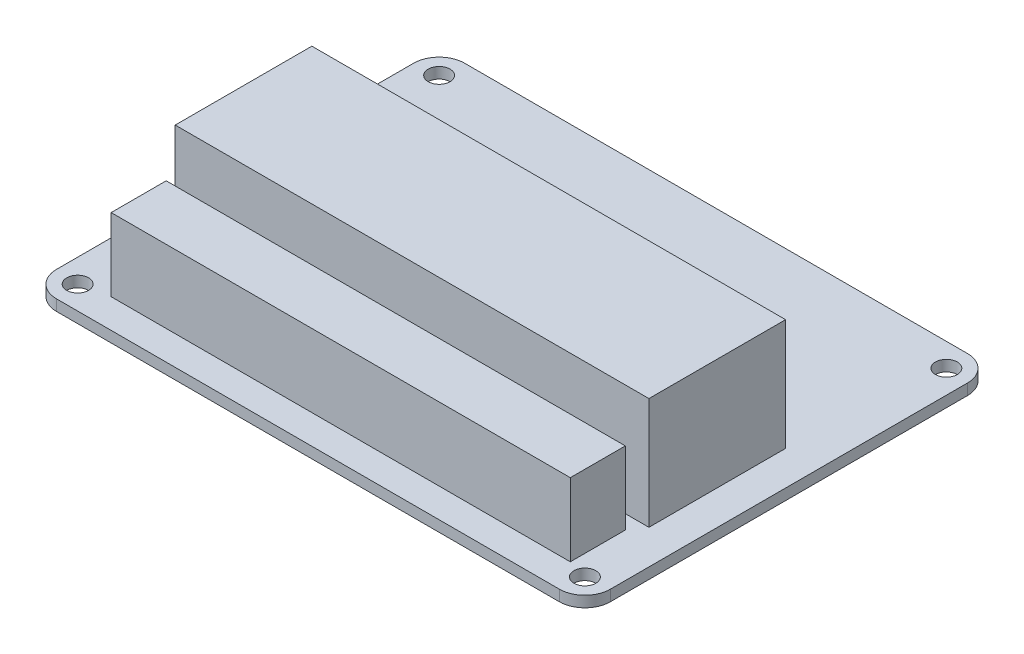
ISO-10303-21;
HEADER;
FILE_DESCRIPTION(('STEP AP214'),'2;1');
FILE_NAME('part.step','',(''),(''),'','','');
FILE_SCHEMA(('AUTOMOTIVE_DESIGN { 1 0 10303 214 1 1 1 1 }'));
ENDSEC;
DATA;
#1=APPLICATION_CONTEXT('core data for automotive mechanical design processes');
#2=APPLICATION_PROTOCOL_DEFINITION('international standard','automotive_design',2000,#1);
#3=PRODUCT_CONTEXT('',#1,'mechanical');
#4=PRODUCT('Part','Part','',(#3));
#5=PRODUCT_RELATED_PRODUCT_CATEGORY('part','',(#4));
#6=PRODUCT_DEFINITION_FORMATION('','',#4);
#7=PRODUCT_DEFINITION_CONTEXT('part definition',#1,'design');
#8=PRODUCT_DEFINITION('design','',#6,#7);
#9=PRODUCT_DEFINITION_SHAPE('','',#8);
#10=(LENGTH_UNIT() NAMED_UNIT(*) SI_UNIT(.MILLI.,.METRE.));
#11=(NAMED_UNIT(*) PLANE_ANGLE_UNIT() SI_UNIT($,.RADIAN.));
#12=(NAMED_UNIT(*) SI_UNIT($,.STERADIAN.) SOLID_ANGLE_UNIT());
#13=UNCERTAINTY_MEASURE_WITH_UNIT(LENGTH_MEASURE(1.E-05),#10,'distance_accuracy_value','');
#14=(GEOMETRIC_REPRESENTATION_CONTEXT(3) GLOBAL_UNCERTAINTY_ASSIGNED_CONTEXT((#13)) GLOBAL_UNIT_ASSIGNED_CONTEXT((#10,
#11,#12)) REPRESENTATION_CONTEXT('',''));
#15=CARTESIAN_POINT('',(0.,0.,0.));
#16=DIRECTION('',(0.,0.,1.));
#17=DIRECTION('',(1.,0.,0.));
#18=AXIS2_PLACEMENT_3D('',#15,#16,#17);
#19=CARTESIAN_POINT('',(0.,1.5,56.));
#20=DIRECTION('',(0.,0.,1.));
#21=DIRECTION('',(1.,0.,0.));
#22=AXIS2_PLACEMENT_3D('',#19,#20,#21);
#23=PLANE('',#22);
#24=DIRECTION('',(-1.,0.,0.));
#25=VECTOR('',#24,1.);
#26=CARTESIAN_POINT('',(0.,0.,56.));
#27=LINE('',#26,#25);
#28=CARTESIAN_POINT('',(72.5,0.,56.));
#29=VERTEX_POINT('',#28);
#30=CARTESIAN_POINT('',(3.5,0.,56.));
#31=VERTEX_POINT('',#30);
#32=EDGE_CURVE('E248',#29,#31,#27,.T.);
#33=ORIENTED_EDGE('',*,*,#32,.F.);
#34=DIRECTION('',(0.,-1.,0.));
#35=VECTOR('',#34,1.);
#36=CARTESIAN_POINT('',(72.5,1.5,56.));
#37=LINE('',#36,#35);
#38=CARTESIAN_POINT('',(72.5,1.5,56.));
#39=VERTEX_POINT('',#38);
#40=EDGE_CURVE('E296',#29,#39,#37,.F.);
#41=ORIENTED_EDGE('',*,*,#40,.T.);
#42=DIRECTION('',(-1.,0.,0.));
#43=VECTOR('',#42,1.);
#44=CARTESIAN_POINT('',(0.,1.5,56.));
#45=LINE('',#44,#43);
#46=CARTESIAN_POINT('',(3.5,1.5,56.));
#47=VERTEX_POINT('',#46);
#48=EDGE_CURVE('E223',#39,#47,#45,.T.);
#49=ORIENTED_EDGE('',*,*,#48,.T.);
#50=DIRECTION('',(0.,-1.,0.));
#51=VECTOR('',#50,1.);
#52=CARTESIAN_POINT('',(3.5,0.,56.));
#53=LINE('',#52,#51);
#54=EDGE_CURVE('E293',#47,#31,#53,.T.);
#55=ORIENTED_EDGE('',*,*,#54,.T.);
#56=EDGE_LOOP('',(#33,#41,#49,#55));
#57=FACE_BOUND('',#56,.T.);
#58=ADVANCED_FACE('F39',(#57),#23,.T.);
#59=CARTESIAN_POINT('',(76.,1.5,0.));
#60=DIRECTION('',(1.,0.,0.));
#61=DIRECTION('',(0.,0.,-1.));
#62=AXIS2_PLACEMENT_3D('',#59,#60,#61);
#63=PLANE('',#62);
#64=DIRECTION('',(0.,0.,1.));
#65=VECTOR('',#64,1.);
#66=CARTESIAN_POINT('',(76.,0.,0.));
#67=LINE('',#66,#65);
#68=CARTESIAN_POINT('',(76.,0.,3.49999999999999));
#69=VERTEX_POINT('',#68);
#70=CARTESIAN_POINT('',(76.,0.,52.5));
#71=VERTEX_POINT('',#70);
#72=EDGE_CURVE('E251',#69,#71,#67,.T.);
#73=ORIENTED_EDGE('',*,*,#72,.F.);
#74=DIRECTION('',(0.,-1.,0.));
#75=VECTOR('',#74,1.);
#76=CARTESIAN_POINT('',(76.,1.5,3.49999999999999));
#77=LINE('',#76,#75);
#78=CARTESIAN_POINT('',(76.,1.5,3.49999999999999));
#79=VERTEX_POINT('',#78);
#80=EDGE_CURVE('E283',#69,#79,#77,.F.);
#81=ORIENTED_EDGE('',*,*,#80,.T.);
#82=DIRECTION('',(0.,0.,1.));
#83=VECTOR('',#82,1.);
#84=CARTESIAN_POINT('',(76.,1.5,0.));
#85=LINE('',#84,#83);
#86=CARTESIAN_POINT('',(76.,1.5,52.5));
#87=VERTEX_POINT('',#86);
#88=EDGE_CURVE('E227',#79,#87,#85,.T.);
#89=ORIENTED_EDGE('',*,*,#88,.T.);
#90=DIRECTION('',(0.,-1.,0.));
#91=VECTOR('',#90,1.);
#92=CARTESIAN_POINT('',(76.,1.5,52.5));
#93=LINE('',#92,#91);
#94=EDGE_CURVE('E280',#87,#71,#93,.T.);
#95=ORIENTED_EDGE('',*,*,#94,.T.);
#96=EDGE_LOOP('',(#73,#81,#89,#95));
#97=FACE_BOUND('',#96,.T.);
#98=ADVANCED_FACE('F328',(#97),#63,.T.);
#99=CARTESIAN_POINT('',(0.,1.5,0.));
#100=DIRECTION('',(0.,0.,1.));
#101=DIRECTION('',(1.,0.,0.));
#102=AXIS2_PLACEMENT_3D('',#99,#100,#101);
#103=PLANE('',#102);
#104=DIRECTION('',(-1.,0.,0.));
#105=VECTOR('',#104,1.);
#106=CARTESIAN_POINT('',(0.,1.5,0.));
#107=LINE('',#106,#105);
#108=CARTESIAN_POINT('',(72.5,1.5,0.));
#109=VERTEX_POINT('',#108);
#110=CARTESIAN_POINT('',(3.5,1.5,0.));
#111=VERTEX_POINT('',#110);
#112=EDGE_CURVE('E230',#109,#111,#107,.T.);
#113=ORIENTED_EDGE('',*,*,#112,.F.);
#114=DIRECTION('',(0.,-1.,0.));
#115=VECTOR('',#114,1.);
#116=CARTESIAN_POINT('',(72.5,0.,0.));
#117=LINE('',#116,#115);
#118=CARTESIAN_POINT('',(72.5,0.,0.));
#119=VERTEX_POINT('',#118);
#120=EDGE_CURVE('E269',#109,#119,#117,.T.);
#121=ORIENTED_EDGE('',*,*,#120,.T.);
#122=DIRECTION('',(-1.,0.,0.));
#123=VECTOR('',#122,1.);
#124=CARTESIAN_POINT('',(0.,0.,0.));
#125=LINE('',#124,#123);
#126=CARTESIAN_POINT('',(3.5,0.,0.));
#127=VERTEX_POINT('',#126);
#128=EDGE_CURVE('E254',#119,#127,#125,.T.);
#129=ORIENTED_EDGE('',*,*,#128,.T.);
#130=DIRECTION('',(0.,-1.,0.));
#131=VECTOR('',#130,1.);
#132=CARTESIAN_POINT('',(3.5,1.5,0.));
#133=LINE('',#132,#131);
#134=EDGE_CURVE('E245',#127,#111,#133,.F.);
#135=ORIENTED_EDGE('',*,*,#134,.T.);
#136=EDGE_LOOP('',(#113,#121,#129,#135));
#137=FACE_BOUND('',#136,.T.);
#138=ADVANCED_FACE('F336',(#137),#103,.F.);
#139=CARTESIAN_POINT('',(3.20000000000001,1.5,3.19999999999999));
#140=DIRECTION('',(0.,-1.,0.));
#141=DIRECTION('',(0.,0.,-1.));
#142=AXIS2_PLACEMENT_3D('',#139,#140,#141);
#143=CYLINDRICAL_SURFACE('',#142,1.5);
#144=CARTESIAN_POINT('',(3.20000000000001,1.5,3.19999999999999));
#145=DIRECTION('',(0.,1.,0.));
#146=DIRECTION('',(0.,0.,1.));
#147=AXIS2_PLACEMENT_3D('',#144,#145,#146);
#148=CIRCLE('',#147,1.5);
#149=CARTESIAN_POINT('',(3.20000000000001,1.5,4.69999999999999));
#150=VERTEX_POINT('',#149);
#151=EDGE_CURVE('E239',#150,#150,#148,.F.);
#152=ORIENTED_EDGE('',*,*,#151,.F.);
#153=EDGE_LOOP('',(#152));
#154=FACE_BOUND('',#153,.T.);
#155=CARTESIAN_POINT('',(3.20000000000001,0.,3.19999999999999));
#156=DIRECTION('',(0.,1.,0.));
#157=DIRECTION('',(0.,0.,1.));
#158=AXIS2_PLACEMENT_3D('',#155,#156,#157);
#159=CIRCLE('',#158,1.5);
#160=CARTESIAN_POINT('',(3.20000000000001,0.,4.69999999999999));
#161=VERTEX_POINT('',#160);
#162=EDGE_CURVE('E263',#161,#161,#159,.F.);
#163=ORIENTED_EDGE('',*,*,#162,.T.);
#164=EDGE_LOOP('',(#163));
#165=FACE_BOUND('',#164,.T.);
#166=ADVANCED_FACE('F551',(#154,#165),#143,.F.);
#167=CARTESIAN_POINT('',(72.8,1.5,52.8));
#168=DIRECTION('',(0.,-1.,0.));
#169=DIRECTION('',(0.,0.,-1.));
#170=AXIS2_PLACEMENT_3D('',#167,#168,#169);
#171=CYLINDRICAL_SURFACE('',#170,1.5);
#172=CARTESIAN_POINT('',(72.8,1.5,52.8));
#173=DIRECTION('',(0.,1.,0.));
#174=DIRECTION('',(0.,0.,1.));
#175=AXIS2_PLACEMENT_3D('',#172,#173,#174);
#176=CIRCLE('',#175,1.5);
#177=CARTESIAN_POINT('',(72.8,1.5,54.3));
#178=VERTEX_POINT('',#177);
#179=EDGE_CURVE('E236',#178,#178,#176,.T.);
#180=ORIENTED_EDGE('',*,*,#179,.T.);
#181=EDGE_LOOP('',(#180));
#182=FACE_BOUND('',#181,.T.);
#183=CARTESIAN_POINT('',(72.8,0.,52.8));
#184=DIRECTION('',(0.,1.,0.));
#185=DIRECTION('',(0.,0.,1.));
#186=AXIS2_PLACEMENT_3D('',#183,#184,#185);
#187=CIRCLE('',#186,1.5);
#188=CARTESIAN_POINT('',(72.8,0.,54.3));
#189=VERTEX_POINT('',#188);
#190=EDGE_CURVE('E260',#189,#189,#187,.T.);
#191=ORIENTED_EDGE('',*,*,#190,.F.);
#192=EDGE_LOOP('',(#191));
#193=FACE_BOUND('',#192,.T.);
#194=ADVANCED_FACE('F542',(#182,#193),#171,.F.);
#195=CARTESIAN_POINT('',(0.,1.5,0.));
#196=DIRECTION('',(1.,0.,0.));
#197=DIRECTION('',(0.,0.,-1.));
#198=AXIS2_PLACEMENT_3D('',#195,#196,#197);
#199=PLANE('',#198);
#200=DIRECTION('',(0.,0.,1.));
#201=VECTOR('',#200,1.);
#202=CARTESIAN_POINT('',(0.,0.,0.));
#203=LINE('',#202,#201);
#204=CARTESIAN_POINT('',(0.,0.,3.5));
#205=VERTEX_POINT('',#204);
#206=CARTESIAN_POINT('',(0.,0.,52.5));
#207=VERTEX_POINT('',#206);
#208=EDGE_CURVE('E257',#205,#207,#203,.T.);
#209=ORIENTED_EDGE('',*,*,#208,.T.);
#210=DIRECTION('',(0.,-1.,0.));
#211=VECTOR('',#210,1.);
#212=CARTESIAN_POINT('',(0.,1.5,52.5));
#213=LINE('',#212,#211);
#214=CARTESIAN_POINT('',(0.,1.5,52.5));
#215=VERTEX_POINT('',#214);
#216=EDGE_CURVE('E11',#207,#215,#213,.F.);
#217=ORIENTED_EDGE('',*,*,#216,.T.);
#218=DIRECTION('',(0.,0.,1.));
#219=VECTOR('',#218,1.);
#220=CARTESIAN_POINT('',(0.,1.5,0.));
#221=LINE('',#220,#219);
#222=CARTESIAN_POINT('',(0.,1.5,3.5));
#223=VERTEX_POINT('',#222);
#224=EDGE_CURVE('E233',#223,#215,#221,.T.);
#225=ORIENTED_EDGE('',*,*,#224,.F.);
#226=DIRECTION('',(0.,-1.,0.));
#227=VECTOR('',#226,1.);
#228=CARTESIAN_POINT('',(0.,1.5,3.5));
#229=LINE('',#228,#227);
#230=EDGE_CURVE('E47',#223,#205,#229,.T.);
#231=ORIENTED_EDGE('',*,*,#230,.T.);
#232=EDGE_LOOP('',(#209,#217,#225,#231));
#233=FACE_BOUND('',#232,.T.);
#234=ADVANCED_FACE('F302',(#233),#199,.F.);
#235=CARTESIAN_POINT('',(72.8,1.5,3.19999999999999));
#236=DIRECTION('',(0.,-1.,0.));
#237=DIRECTION('',(0.,0.,-1.));
#238=AXIS2_PLACEMENT_3D('',#235,#236,#237);
#239=CYLINDRICAL_SURFACE('',#238,1.5);
#240=CARTESIAN_POINT('',(72.8,1.5,3.19999999999999));
#241=DIRECTION('',(0.,1.,0.));
#242=DIRECTION('',(0.,0.,1.));
#243=AXIS2_PLACEMENT_3D('',#240,#241,#242);
#244=CIRCLE('',#243,1.5);
#245=CARTESIAN_POINT('',(72.8,1.5,4.69999999999999));
#246=VERTEX_POINT('',#245);
#247=EDGE_CURVE('E220',#246,#246,#244,.T.);
#248=ORIENTED_EDGE('',*,*,#247,.T.);
#249=EDGE_LOOP('',(#248));
#250=FACE_BOUND('',#249,.T.);
#251=CARTESIAN_POINT('',(72.8,0.,3.19999999999999));
#252=DIRECTION('',(0.,1.,0.));
#253=DIRECTION('',(0.,0.,1.));
#254=AXIS2_PLACEMENT_3D('',#251,#252,#253);
#255=CIRCLE('',#254,1.5);
#256=CARTESIAN_POINT('',(72.8,0.,4.69999999999999));
#257=VERTEX_POINT('',#256);
#258=EDGE_CURVE('E219',#257,#257,#255,.T.);
#259=ORIENTED_EDGE('',*,*,#258,.F.);
#260=EDGE_LOOP('',(#259));
#261=FACE_BOUND('',#260,.T.);
#262=ADVANCED_FACE('F355',(#250,#261),#239,.F.);
#263=CARTESIAN_POINT('',(3.19999999999999,1.5,52.8));
#264=DIRECTION('',(0.,-1.,0.));
#265=DIRECTION('',(0.,0.,-1.));
#266=AXIS2_PLACEMENT_3D('',#263,#264,#265);
#267=CYLINDRICAL_SURFACE('',#266,1.5);
#268=CARTESIAN_POINT('',(3.19999999999999,1.5,52.8));
#269=DIRECTION('',(0.,1.,0.));
#270=DIRECTION('',(0.,0.,1.));
#271=AXIS2_PLACEMENT_3D('',#268,#269,#270);
#272=CIRCLE('',#271,1.5);
#273=CARTESIAN_POINT('',(3.19999999999999,1.5,54.3));
#274=VERTEX_POINT('',#273);
#275=EDGE_CURVE('E242',#274,#274,#272,.F.);
#276=ORIENTED_EDGE('',*,*,#275,.F.);
#277=EDGE_LOOP('',(#276));
#278=FACE_BOUND('',#277,.T.);
#279=CARTESIAN_POINT('',(3.19999999999999,0.,52.8));
#280=DIRECTION('',(0.,1.,0.));
#281=DIRECTION('',(0.,0.,1.));
#282=AXIS2_PLACEMENT_3D('',#279,#280,#281);
#283=CIRCLE('',#282,1.5);
#284=CARTESIAN_POINT('',(3.19999999999999,0.,54.3));
#285=VERTEX_POINT('',#284);
#286=EDGE_CURVE('E224',#285,#285,#283,.F.);
#287=ORIENTED_EDGE('',*,*,#286,.T.);
#288=EDGE_LOOP('',(#287));
#289=FACE_BOUND('',#288,.T.);
#290=ADVANCED_FACE('F358',(#278,#289),#267,.F.);
#291=CARTESIAN_POINT('',(0.,1.5,0.));
#292=DIRECTION('',(0.,1.,0.));
#293=DIRECTION('',(0.,0.,1.));
#294=AXIS2_PLACEMENT_3D('',#291,#292,#293);
#295=PLANE('',#294);
#296=DIRECTION('',(0.,0.,-1.));
#297=VECTOR('',#296,1.);
#298=CARTESIAN_POINT('',(6.29412363771111,1.5,0.));
#299=LINE('',#298,#297);
#300=CARTESIAN_POINT('',(6.29412363771111,1.5,42.5053644216807));
#301=VERTEX_POINT('',#300);
#302=CARTESIAN_POINT('',(6.29412363771111,1.5,23.7553644216807));
#303=VERTEX_POINT('',#302);
#304=EDGE_CURVE('E160',#301,#303,#299,.T.);
#305=ORIENTED_EDGE('',*,*,#304,.T.);
#306=DIRECTION('',(-1.,0.,0.));
#307=VECTOR('',#306,1.);
#308=CARTESIAN_POINT('',(0.,1.5,23.7553644216807));
#309=LINE('',#308,#307);
#310=CARTESIAN_POINT('',(71.2941236377111,1.5,23.7553644216807));
#311=VERTEX_POINT('',#310);
#312=EDGE_CURVE('E174',#311,#303,#309,.T.);
#313=ORIENTED_EDGE('',*,*,#312,.F.);
#314=DIRECTION('',(0.,0.,-1.));
#315=VECTOR('',#314,1.);
#316=CARTESIAN_POINT('',(71.2941236377111,1.5,0.));
#317=LINE('',#316,#315);
#318=CARTESIAN_POINT('',(71.2941236377111,1.5,42.5053644216807));
#319=VERTEX_POINT('',#318);
#320=EDGE_CURVE('E187',#319,#311,#317,.T.);
#321=ORIENTED_EDGE('',*,*,#320,.F.);
#322=DIRECTION('',(-1.,0.,0.));
#323=VECTOR('',#322,1.);
#324=CARTESIAN_POINT('',(0.,1.5,42.5053644216807));
#325=LINE('',#324,#323);
#326=EDGE_CURVE('E185',#319,#301,#325,.T.);
#327=ORIENTED_EDGE('',*,*,#326,.T.);
#328=EDGE_LOOP('',(#305,#313,#321,#327));
#329=FACE_BOUND('',#328,.T.);
#330=DIRECTION('',(0.,0.,-1.));
#331=VECTOR('',#330,1.);
#332=CARTESIAN_POINT('',(6.99999999999999,1.5,0.));
#333=LINE('',#332,#331);
#334=CARTESIAN_POINT('',(6.99999999999999,1.5,52.));
#335=VERTEX_POINT('',#334);
#336=CARTESIAN_POINT('',(6.99999999999999,1.5,44.45));
#337=VERTEX_POINT('',#336);
#338=EDGE_CURVE('E165',#335,#337,#333,.T.);
#339=ORIENTED_EDGE('',*,*,#338,.T.);
#340=DIRECTION('',(-1.,0.,0.));
#341=VECTOR('',#340,1.);
#342=CARTESIAN_POINT('',(0.,1.5,44.45));
#343=LINE('',#342,#341);
#344=CARTESIAN_POINT('',(70.,1.5,44.45));
#345=VERTEX_POINT('',#344);
#346=EDGE_CURVE('E197',#345,#337,#343,.T.);
#347=ORIENTED_EDGE('',*,*,#346,.F.);
#348=DIRECTION('',(0.,0.,-1.));
#349=VECTOR('',#348,1.);
#350=CARTESIAN_POINT('',(70.,1.5,0.));
#351=LINE('',#350,#349);
#352=CARTESIAN_POINT('',(70.,1.5,52.));
#353=VERTEX_POINT('',#352);
#354=EDGE_CURVE('E210',#353,#345,#351,.T.);
#355=ORIENTED_EDGE('',*,*,#354,.F.);
#356=DIRECTION('',(-1.,0.,0.));
#357=VECTOR('',#356,1.);
#358=CARTESIAN_POINT('',(0.,1.5,52.));
#359=LINE('',#358,#357);
#360=EDGE_CURVE('E207',#353,#335,#359,.T.);
#361=ORIENTED_EDGE('',*,*,#360,.T.);
#362=EDGE_LOOP('',(#339,#347,#355,#361));
#363=FACE_BOUND('',#362,.T.);
#364=ORIENTED_EDGE('',*,*,#247,.F.);
#365=EDGE_LOOP('',(#364));
#366=FACE_BOUND('',#365,.T.);
#367=ORIENTED_EDGE('',*,*,#88,.F.);
#368=CARTESIAN_POINT('',(72.5,1.5,3.49999999999999));
#369=DIRECTION('',(0.,1.,0.));
#370=DIRECTION('',(0.,0.,1.));
#371=AXIS2_PLACEMENT_3D('',#368,#369,#370);
#372=CIRCLE('',#371,3.5);
#373=EDGE_CURVE('E291',#79,#109,#372,.T.);
#374=ORIENTED_EDGE('',*,*,#373,.T.);
#375=ORIENTED_EDGE('',*,*,#112,.T.);
#376=CARTESIAN_POINT('',(3.5,1.5,3.5));
#377=DIRECTION('',(0.,1.,0.));
#378=DIRECTION('',(0.,0.,1.));
#379=AXIS2_PLACEMENT_3D('',#376,#377,#378);
#380=CIRCLE('',#379,3.5);
#381=EDGE_CURVE('E285',#111,#223,#380,.T.);
#382=ORIENTED_EDGE('',*,*,#381,.T.);
#383=ORIENTED_EDGE('',*,*,#224,.T.);
#384=CARTESIAN_POINT('',(3.5,1.5,52.5));
#385=DIRECTION('',(0.,1.,0.));
#386=DIRECTION('',(0.,0.,1.));
#387=AXIS2_PLACEMENT_3D('',#384,#385,#386);
#388=CIRCLE('',#387,3.5);
#389=EDGE_CURVE('E287',#215,#47,#388,.T.);
#390=ORIENTED_EDGE('',*,*,#389,.T.);
#391=ORIENTED_EDGE('',*,*,#48,.F.);
#392=CARTESIAN_POINT('',(72.5,1.5,52.5));
#393=DIRECTION('',(0.,1.,0.));
#394=DIRECTION('',(0.,0.,1.));
#395=AXIS2_PLACEMENT_3D('',#392,#393,#394);
#396=CIRCLE('',#395,3.5);
#397=EDGE_CURVE('E289',#39,#87,#396,.T.);
#398=ORIENTED_EDGE('',*,*,#397,.T.);
#399=EDGE_LOOP('',(#367,#374,#375,#382,#383,#390,#391,#398));
#400=FACE_BOUND('',#399,.T.);
#401=ORIENTED_EDGE('',*,*,#179,.F.);
#402=EDGE_LOOP('',(#401));
#403=FACE_BOUND('',#402,.T.);
#404=ORIENTED_EDGE('',*,*,#151,.T.);
#405=EDGE_LOOP('',(#404));
#406=FACE_BOUND('',#405,.T.);
#407=ORIENTED_EDGE('',*,*,#275,.T.);
#408=EDGE_LOOP('',(#407));
#409=FACE_BOUND('',#408,.T.);
#410=ADVANCED_FACE('F321',(#329,#363,#366,#400,#403,#406,#409),#295,.T.);
#411=CARTESIAN_POINT('',(0.,0.,0.));
#412=DIRECTION('',(0.,1.,0.));
#413=DIRECTION('',(0.,0.,1.));
#414=AXIS2_PLACEMENT_3D('',#411,#412,#413);
#415=PLANE('',#414);
#416=ORIENTED_EDGE('',*,*,#258,.T.);
#417=EDGE_LOOP('',(#416));
#418=FACE_BOUND('',#417,.T.);
#419=ORIENTED_EDGE('',*,*,#128,.F.);
#420=CARTESIAN_POINT('',(72.5,0.,3.49999999999999));
#421=DIRECTION('',(0.,1.,0.));
#422=DIRECTION('',(0.,0.,1.));
#423=AXIS2_PLACEMENT_3D('',#420,#421,#422);
#424=CIRCLE('',#423,3.5);
#425=EDGE_CURVE('E278',#119,#69,#424,.F.);
#426=ORIENTED_EDGE('',*,*,#425,.T.);
#427=ORIENTED_EDGE('',*,*,#72,.T.);
#428=CARTESIAN_POINT('',(72.5,0.,52.5));
#429=DIRECTION('',(0.,1.,0.));
#430=DIRECTION('',(0.,0.,1.));
#431=AXIS2_PLACEMENT_3D('',#428,#429,#430);
#432=CIRCLE('',#431,3.5);
#433=EDGE_CURVE('E276',#71,#29,#432,.F.);
#434=ORIENTED_EDGE('',*,*,#433,.T.);
#435=ORIENTED_EDGE('',*,*,#32,.T.);
#436=CARTESIAN_POINT('',(3.5,0.,52.5));
#437=DIRECTION('',(0.,1.,0.));
#438=DIRECTION('',(0.,0.,1.));
#439=AXIS2_PLACEMENT_3D('',#436,#437,#438);
#440=CIRCLE('',#439,3.5);
#441=EDGE_CURVE('E274',#31,#207,#440,.F.);
#442=ORIENTED_EDGE('',*,*,#441,.T.);
#443=ORIENTED_EDGE('',*,*,#208,.F.);
#444=CARTESIAN_POINT('',(3.5,0.,3.5));
#445=DIRECTION('',(0.,1.,0.));
#446=DIRECTION('',(0.,0.,1.));
#447=AXIS2_PLACEMENT_3D('',#444,#445,#446);
#448=CIRCLE('',#447,3.5);
#449=EDGE_CURVE('E272',#205,#127,#448,.F.);
#450=ORIENTED_EDGE('',*,*,#449,.T.);
#451=EDGE_LOOP('',(#419,#426,#427,#434,#435,#442,#443,#450));
#452=FACE_BOUND('',#451,.T.);
#453=ORIENTED_EDGE('',*,*,#190,.T.);
#454=EDGE_LOOP('',(#453));
#455=FACE_BOUND('',#454,.T.);
#456=ORIENTED_EDGE('',*,*,#162,.F.);
#457=EDGE_LOOP('',(#456));
#458=FACE_BOUND('',#457,.T.);
#459=ORIENTED_EDGE('',*,*,#286,.F.);
#460=EDGE_LOOP('',(#459));
#461=FACE_BOUND('',#460,.T.);
#462=ADVANCED_FACE('F308',(#418,#452,#455,#458,#461),#415,.F.);
#463=CARTESIAN_POINT('',(72.5,1.5,3.49999999999999));
#464=DIRECTION('',(0.,1.,0.));
#465=DIRECTION('',(0.,0.,1.));
#466=AXIS2_PLACEMENT_3D('',#463,#464,#465);
#467=CYLINDRICAL_SURFACE('',#466,3.5);
#468=ORIENTED_EDGE('',*,*,#373,.F.);
#469=ORIENTED_EDGE('',*,*,#80,.F.);
#470=ORIENTED_EDGE('',*,*,#425,.F.);
#471=ORIENTED_EDGE('',*,*,#120,.F.);
#472=EDGE_LOOP('',(#468,#469,#470,#471));
#473=FACE_BOUND('',#472,.T.);
#474=ADVANCED_FACE('F333',(#473),#467,.T.);
#475=CARTESIAN_POINT('',(72.5,1.5,52.5));
#476=DIRECTION('',(0.,-1.,0.));
#477=DIRECTION('',(0.,0.,-1.));
#478=AXIS2_PLACEMENT_3D('',#475,#476,#477);
#479=CYLINDRICAL_SURFACE('',#478,3.5);
#480=ORIENTED_EDGE('',*,*,#397,.F.);
#481=ORIENTED_EDGE('',*,*,#40,.F.);
#482=ORIENTED_EDGE('',*,*,#433,.F.);
#483=ORIENTED_EDGE('',*,*,#94,.F.);
#484=EDGE_LOOP('',(#480,#481,#482,#483));
#485=FACE_BOUND('',#484,.T.);
#486=ADVANCED_FACE('F325',(#485),#479,.T.);
#487=CARTESIAN_POINT('',(3.5,1.5,52.5));
#488=DIRECTION('',(0.,1.,0.));
#489=DIRECTION('',(0.,0.,1.));
#490=AXIS2_PLACEMENT_3D('',#487,#488,#489);
#491=CYLINDRICAL_SURFACE('',#490,3.5);
#492=ORIENTED_EDGE('',*,*,#389,.F.);
#493=ORIENTED_EDGE('',*,*,#216,.F.);
#494=ORIENTED_EDGE('',*,*,#441,.F.);
#495=ORIENTED_EDGE('',*,*,#54,.F.);
#496=EDGE_LOOP('',(#492,#493,#494,#495));
#497=FACE_BOUND('',#496,.T.);
#498=ADVANCED_FACE('F314',(#497),#491,.T.);
#499=CARTESIAN_POINT('',(3.5,1.5,3.5));
#500=DIRECTION('',(0.,-1.,0.));
#501=DIRECTION('',(0.,0.,-1.));
#502=AXIS2_PLACEMENT_3D('',#499,#500,#501);
#503=CYLINDRICAL_SURFACE('',#502,3.5);
#504=ORIENTED_EDGE('',*,*,#381,.F.);
#505=ORIENTED_EDGE('',*,*,#134,.F.);
#506=ORIENTED_EDGE('',*,*,#449,.F.);
#507=ORIENTED_EDGE('',*,*,#230,.F.);
#508=EDGE_LOOP('',(#504,#505,#506,#507));
#509=FACE_BOUND('',#508,.T.);
#510=ADVANCED_FACE('F41',(#509),#503,.T.);
#511=CARTESIAN_POINT('',(6.99999999999999,11.5,0.));
#512=DIRECTION('',(-1.,0.,0.));
#513=DIRECTION('',(0.,0.,1.));
#514=AXIS2_PLACEMENT_3D('',#511,#512,#513);
#515=PLANE('',#514);
#516=ORIENTED_EDGE('',*,*,#338,.F.);
#517=DIRECTION('',(0.,-1.,0.));
#518=VECTOR('',#517,1.);
#519=CARTESIAN_POINT('',(6.99999999999999,11.5,52.));
#520=LINE('',#519,#518);
#521=CARTESIAN_POINT('',(6.99999999999999,11.5,52.));
#522=VERTEX_POINT('',#521);
#523=EDGE_CURVE('E217',#522,#335,#520,.T.);
#524=ORIENTED_EDGE('',*,*,#523,.F.);
#525=DIRECTION('',(0.,0.,-1.));
#526=VECTOR('',#525,1.);
#527=CARTESIAN_POINT('',(6.99999999999999,11.5,0.));
#528=LINE('',#527,#526);
#529=CARTESIAN_POINT('',(6.99999999999999,11.5,44.45));
#530=VERTEX_POINT('',#529);
#531=EDGE_CURVE('E193',#522,#530,#528,.T.);
#532=ORIENTED_EDGE('',*,*,#531,.T.);
#533=DIRECTION('',(0.,-1.,0.));
#534=VECTOR('',#533,1.);
#535=CARTESIAN_POINT('',(6.99999999999999,11.5,44.45));
#536=LINE('',#535,#534);
#537=EDGE_CURVE('E204',#530,#337,#536,.T.);
#538=ORIENTED_EDGE('',*,*,#537,.T.);
#539=EDGE_LOOP('',(#516,#524,#532,#538));
#540=FACE_BOUND('',#539,.T.);
#541=ADVANCED_FACE('F339',(#540),#515,.T.);
#542=CARTESIAN_POINT('',(0.,11.5,52.));
#543=DIRECTION('',(0.,0.,1.));
#544=DIRECTION('',(1.,0.,0.));
#545=AXIS2_PLACEMENT_3D('',#542,#543,#544);
#546=PLANE('',#545);
#547=ORIENTED_EDGE('',*,*,#360,.F.);
#548=DIRECTION('',(0.,-1.,0.));
#549=VECTOR('',#548,1.);
#550=CARTESIAN_POINT('',(70.,11.5,52.));
#551=LINE('',#550,#549);
#552=CARTESIAN_POINT('',(70.,11.5,52.));
#553=VERTEX_POINT('',#552);
#554=EDGE_CURVE('E215',#553,#353,#551,.T.);
#555=ORIENTED_EDGE('',*,*,#554,.F.);
#556=DIRECTION('',(-1.,0.,0.));
#557=VECTOR('',#556,1.);
#558=CARTESIAN_POINT('',(0.,11.5,52.));
#559=LINE('',#558,#557);
#560=EDGE_CURVE('E196',#553,#522,#559,.T.);
#561=ORIENTED_EDGE('',*,*,#560,.T.);
#562=ORIENTED_EDGE('',*,*,#523,.T.);
#563=EDGE_LOOP('',(#547,#555,#561,#562));
#564=FACE_BOUND('',#563,.T.);
#565=ADVANCED_FACE('F344',(#564),#546,.T.);
#566=CARTESIAN_POINT('',(70.,11.5,0.));
#567=DIRECTION('',(-1.,0.,0.));
#568=DIRECTION('',(0.,0.,1.));
#569=AXIS2_PLACEMENT_3D('',#566,#567,#568);
#570=PLANE('',#569);
#571=ORIENTED_EDGE('',*,*,#354,.T.);
#572=DIRECTION('',(0.,-1.,0.));
#573=VECTOR('',#572,1.);
#574=CARTESIAN_POINT('',(70.,11.5,44.45));
#575=LINE('',#574,#573);
#576=CARTESIAN_POINT('',(70.,11.5,44.45));
#577=VERTEX_POINT('',#576);
#578=EDGE_CURVE('E62',#577,#345,#575,.T.);
#579=ORIENTED_EDGE('',*,*,#578,.F.);
#580=DIRECTION('',(0.,0.,-1.));
#581=VECTOR('',#580,1.);
#582=CARTESIAN_POINT('',(70.,11.5,0.));
#583=LINE('',#582,#581);
#584=EDGE_CURVE('E200',#553,#577,#583,.T.);
#585=ORIENTED_EDGE('',*,*,#584,.F.);
#586=ORIENTED_EDGE('',*,*,#554,.T.);
#587=EDGE_LOOP('',(#571,#579,#585,#586));
#588=FACE_BOUND('',#587,.T.);
#589=ADVANCED_FACE('F394',(#588),#570,.F.);
#590=CARTESIAN_POINT('',(0.,11.5,44.45));
#591=DIRECTION('',(0.,0.,1.));
#592=DIRECTION('',(1.,0.,0.));
#593=AXIS2_PLACEMENT_3D('',#590,#591,#592);
#594=PLANE('',#593);
#595=ORIENTED_EDGE('',*,*,#346,.T.);
#596=ORIENTED_EDGE('',*,*,#537,.F.);
#597=DIRECTION('',(-1.,0.,0.));
#598=VECTOR('',#597,1.);
#599=CARTESIAN_POINT('',(0.,11.5,44.45));
#600=LINE('',#599,#598);
#601=EDGE_CURVE('E202',#577,#530,#600,.T.);
#602=ORIENTED_EDGE('',*,*,#601,.F.);
#603=ORIENTED_EDGE('',*,*,#578,.T.);
#604=EDGE_LOOP('',(#595,#596,#602,#603));
#605=FACE_BOUND('',#604,.T.);
#606=ADVANCED_FACE('F405',(#605),#594,.F.);
#607=CARTESIAN_POINT('',(0.,11.5,0.));
#608=DIRECTION('',(0.,1.,0.));
#609=DIRECTION('',(0.,0.,1.));
#610=AXIS2_PLACEMENT_3D('',#607,#608,#609);
#611=PLANE('',#610);
#612=ORIENTED_EDGE('',*,*,#531,.F.);
#613=ORIENTED_EDGE('',*,*,#560,.F.);
#614=ORIENTED_EDGE('',*,*,#584,.T.);
#615=ORIENTED_EDGE('',*,*,#601,.T.);
#616=EDGE_LOOP('',(#612,#613,#614,#615));
#617=FACE_BOUND('',#616,.T.);
#618=ADVANCED_FACE('F416',(#617),#611,.T.);
#619=CARTESIAN_POINT('',(6.29412363771111,16.8,0.));
#620=DIRECTION('',(-1.,0.,0.));
#621=DIRECTION('',(0.,0.,1.));
#622=AXIS2_PLACEMENT_3D('',#619,#620,#621);
#623=PLANE('',#622);
#624=ORIENTED_EDGE('',*,*,#304,.F.);
#625=DIRECTION('',(0.,-1.,0.));
#626=VECTOR('',#625,1.);
#627=CARTESIAN_POINT('',(6.29412363771111,16.8,42.5053644216807));
#628=LINE('',#627,#626);
#629=CARTESIAN_POINT('',(6.29412363771111,16.8,42.5053644216807));
#630=VERTEX_POINT('',#629);
#631=EDGE_CURVE('E155',#630,#301,#628,.T.);
#632=ORIENTED_EDGE('',*,*,#631,.F.);
#633=DIRECTION('',(0.,0.,-1.));
#634=VECTOR('',#633,1.);
#635=CARTESIAN_POINT('',(6.29412363771111,16.8,0.));
#636=LINE('',#635,#634);
#637=CARTESIAN_POINT('',(6.29412363771111,16.8,23.7553644216807));
#638=VERTEX_POINT('',#637);
#639=EDGE_CURVE('E158',#630,#638,#636,.T.);
#640=ORIENTED_EDGE('',*,*,#639,.T.);
#641=DIRECTION('',(0.,-1.,0.));
#642=VECTOR('',#641,1.);
#643=CARTESIAN_POINT('',(6.29412363771111,16.8,23.7553644216807));
#644=LINE('',#643,#642);
#645=EDGE_CURVE('E183',#638,#303,#644,.T.);
#646=ORIENTED_EDGE('',*,*,#645,.T.);
#647=EDGE_LOOP('',(#624,#632,#640,#646));
#648=FACE_BOUND('',#647,.T.);
#649=ADVANCED_FACE('F157',(#648),#623,.T.);
#650=CARTESIAN_POINT('',(0.,16.8,42.5053644216807));
#651=DIRECTION('',(0.,0.,1.));
#652=DIRECTION('',(1.,0.,0.));
#653=AXIS2_PLACEMENT_3D('',#650,#651,#652);
#654=PLANE('',#653);
#655=ORIENTED_EDGE('',*,*,#326,.F.);
#656=DIRECTION('',(0.,-1.,0.));
#657=VECTOR('',#656,1.);
#658=CARTESIAN_POINT('',(71.2941236377111,16.8,42.5053644216807));
#659=LINE('',#658,#657);
#660=CARTESIAN_POINT('',(71.2941236377111,16.8,42.5053644216807));
#661=VERTEX_POINT('',#660);
#662=EDGE_CURVE('E166',#661,#319,#659,.T.);
#663=ORIENTED_EDGE('',*,*,#662,.F.);
#664=DIRECTION('',(-1.,0.,0.));
#665=VECTOR('',#664,1.);
#666=CARTESIAN_POINT('',(0.,16.8,42.5053644216807));
#667=LINE('',#666,#665);
#668=EDGE_CURVE('E171',#661,#630,#667,.T.);
#669=ORIENTED_EDGE('',*,*,#668,.T.);
#670=ORIENTED_EDGE('',*,*,#631,.T.);
#671=EDGE_LOOP('',(#655,#663,#669,#670));
#672=FACE_BOUND('',#671,.T.);
#673=ADVANCED_FACE('F176',(#672),#654,.T.);
#674=CARTESIAN_POINT('',(71.2941236377111,16.8,0.));
#675=DIRECTION('',(-1.,0.,0.));
#676=DIRECTION('',(0.,0.,1.));
#677=AXIS2_PLACEMENT_3D('',#674,#675,#676);
#678=PLANE('',#677);
#679=ORIENTED_EDGE('',*,*,#320,.T.);
#680=DIRECTION('',(0.,-1.,0.));
#681=VECTOR('',#680,1.);
#682=CARTESIAN_POINT('',(71.2941236377111,16.8,23.7553644216807));
#683=LINE('',#682,#681);
#684=CARTESIAN_POINT('',(71.2941236377111,16.8,23.7553644216807));
#685=VERTEX_POINT('',#684);
#686=EDGE_CURVE('E54',#685,#311,#683,.T.);
#687=ORIENTED_EDGE('',*,*,#686,.F.);
#688=DIRECTION('',(0.,0.,-1.));
#689=VECTOR('',#688,1.);
#690=CARTESIAN_POINT('',(71.2941236377111,16.8,0.));
#691=LINE('',#690,#689);
#692=EDGE_CURVE('E178',#661,#685,#691,.T.);
#693=ORIENTED_EDGE('',*,*,#692,.F.);
#694=ORIENTED_EDGE('',*,*,#662,.T.);
#695=EDGE_LOOP('',(#679,#687,#693,#694));
#696=FACE_BOUND('',#695,.T.);
#697=ADVANCED_FACE('F457',(#696),#678,.F.);
#698=CARTESIAN_POINT('',(0.,16.8,23.7553644216807));
#699=DIRECTION('',(0.,0.,1.));
#700=DIRECTION('',(1.,0.,0.));
#701=AXIS2_PLACEMENT_3D('',#698,#699,#700);
#702=PLANE('',#701);
#703=ORIENTED_EDGE('',*,*,#312,.T.);
#704=ORIENTED_EDGE('',*,*,#645,.F.);
#705=DIRECTION('',(-1.,0.,0.));
#706=VECTOR('',#705,1.);
#707=CARTESIAN_POINT('',(0.,16.8,23.7553644216807));
#708=LINE('',#707,#706);
#709=EDGE_CURVE('E172',#685,#638,#708,.T.);
#710=ORIENTED_EDGE('',*,*,#709,.F.);
#711=ORIENTED_EDGE('',*,*,#686,.T.);
#712=EDGE_LOOP('',(#703,#704,#710,#711));
#713=FACE_BOUND('',#712,.T.);
#714=ADVANCED_FACE('F467',(#713),#702,.F.);
#715=CARTESIAN_POINT('',(0.,16.8,0.));
#716=DIRECTION('',(0.,1.,0.));
#717=DIRECTION('',(0.,0.,1.));
#718=AXIS2_PLACEMENT_3D('',#715,#716,#717);
#719=PLANE('',#718);
#720=ORIENTED_EDGE('',*,*,#639,.F.);
#721=ORIENTED_EDGE('',*,*,#668,.F.);
#722=ORIENTED_EDGE('',*,*,#692,.T.);
#723=ORIENTED_EDGE('',*,*,#709,.T.);
#724=EDGE_LOOP('',(#720,#721,#722,#723));
#725=FACE_BOUND('',#724,.T.);
#726=ADVANCED_FACE('F170',(#725),#719,.T.);
#727=CLOSED_SHELL('',(#58,#98,#138,#166,#194,#234,#262,#290,#410,#462,#474,#486,#498,#510,#541,
#565,#589,#606,#618,#649,#673,#697,#714,#726));
#728=MANIFOLD_SOLID_BREP('B2',#727);
#729=ADVANCED_BREP_SHAPE_REPRESENTATION('',(#18,#728),#14);
#730=SHAPE_DEFINITION_REPRESENTATION(#9,#729);
ENDSEC;
END-ISO-10303-21;
